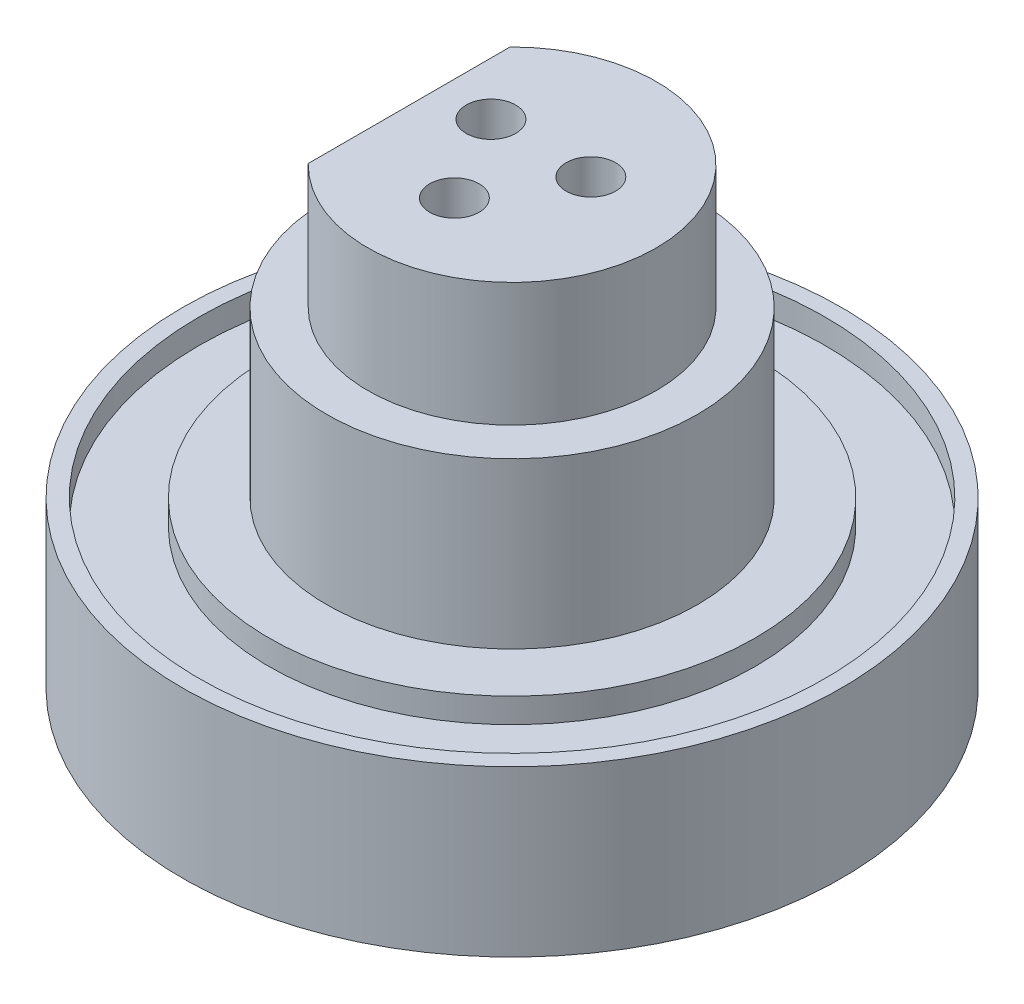
ISO-10303-21;
HEADER;
FILE_DESCRIPTION(('STEP AP214'),'2;1');
FILE_NAME('part.step','',(''),(''),'','','');
FILE_SCHEMA(('AUTOMOTIVE_DESIGN { 1 0 10303 214 1 1 1 1 }'));
ENDSEC;
DATA;
#1=APPLICATION_CONTEXT('core data for automotive mechanical design processes');
#2=APPLICATION_PROTOCOL_DEFINITION('international standard','automotive_design',2000,#1);
#3=PRODUCT_CONTEXT('',#1,'mechanical');
#4=PRODUCT('Part','Part','',(#3));
#5=PRODUCT_RELATED_PRODUCT_CATEGORY('part','',(#4));
#6=PRODUCT_DEFINITION_FORMATION('','',#4);
#7=PRODUCT_DEFINITION_CONTEXT('part definition',#1,'design');
#8=PRODUCT_DEFINITION('design','',#6,#7);
#9=PRODUCT_DEFINITION_SHAPE('','',#8);
#10=(LENGTH_UNIT() NAMED_UNIT(*) SI_UNIT(.MILLI.,.METRE.));
#11=(NAMED_UNIT(*) PLANE_ANGLE_UNIT() SI_UNIT($,.RADIAN.));
#12=(NAMED_UNIT(*) SI_UNIT($,.STERADIAN.) SOLID_ANGLE_UNIT());
#13=UNCERTAINTY_MEASURE_WITH_UNIT(LENGTH_MEASURE(1.E-05),#10,'distance_accuracy_value','');
#14=(GEOMETRIC_REPRESENTATION_CONTEXT(3) GLOBAL_UNCERTAINTY_ASSIGNED_CONTEXT((#13)) GLOBAL_UNIT_ASSIGNED_CONTEXT((#10,
#11,#12)) REPRESENTATION_CONTEXT('',''));
#15=CARTESIAN_POINT('',(0.,0.,0.));
#16=DIRECTION('',(0.,0.,1.));
#17=DIRECTION('',(1.,0.,0.));
#18=AXIS2_PLACEMENT_3D('',#15,#16,#17);
#19=CARTESIAN_POINT('',(0.,0.,0.));
#20=DIRECTION('',(0.,-1.,0.));
#21=DIRECTION('',(0.,0.,-1.));
#22=AXIS2_PLACEMENT_3D('',#19,#20,#21);
#23=PLANE('',#22);
#24=CARTESIAN_POINT('',(0.,0.,0.));
#25=DIRECTION('',(0.,-1.,0.));
#26=DIRECTION('',(1.,0.,0.));
#27=AXIS2_PLACEMENT_3D('',#24,#25,#26);
#28=CIRCLE('',#27,22.5);
#29=CARTESIAN_POINT('',(-22.5,0.,0.));
#30=VERTEX_POINT('',#29);
#31=EDGE_CURVE('E10',#30,#30,#28,.T.);
#32=ORIENTED_EDGE('',*,*,#31,.T.);
#33=EDGE_LOOP('',(#32));
#34=FACE_BOUND('',#33,.T.);
#35=CARTESIAN_POINT('',(0.,0.,0.));
#36=DIRECTION('',(0.,1.,0.));
#37=DIRECTION('',(-1.,0.,0.));
#38=AXIS2_PLACEMENT_3D('',#35,#36,#37);
#39=CIRCLE('',#38,29.5);
#40=CARTESIAN_POINT('',(29.5,0.,0.));
#41=VERTEX_POINT('',#40);
#42=EDGE_CURVE('E358',#41,#41,#39,.T.);
#43=ORIENTED_EDGE('',*,*,#42,.T.);
#44=EDGE_LOOP('',(#43));
#45=FACE_BOUND('',#44,.T.);
#46=ADVANCED_FACE('F15',(#34,#45),#23,.F.);
#47=CARTESIAN_POINT('',(0.,0.,0.));
#48=DIRECTION('',(0.,1.,0.));
#49=DIRECTION('',(1.,0.,0.));
#50=AXIS2_PLACEMENT_3D('',#47,#48,#49);
#51=CYLINDRICAL_SURFACE('',#50,22.5);
#52=CARTESIAN_POINT('',(0.,20.,0.));
#53=DIRECTION('',(0.,-1.,0.));
#54=DIRECTION('',(1.,0.,0.));
#55=AXIS2_PLACEMENT_3D('',#52,#53,#54);
#56=CIRCLE('',#55,22.5);
#57=CARTESIAN_POINT('',(-22.5,20.,0.));
#58=VERTEX_POINT('',#57);
#59=EDGE_CURVE('E184',#58,#58,#56,.T.);
#60=ORIENTED_EDGE('',*,*,#59,.T.);
#61=DIRECTION('',(0.,-1.,0.));
#62=VECTOR('',#61,1.);
#63=CARTESIAN_POINT('',(-22.5,0.,0.));
#64=LINE('',#63,#62);
#65=EDGE_CURVE('E25',#58,#30,#64,.T.);
#66=ORIENTED_EDGE('',*,*,#65,.T.);
#67=ORIENTED_EDGE('',*,*,#31,.F.);
#68=ORIENTED_EDGE('',*,*,#65,.F.);
#69=EDGE_LOOP('',(#60,#66,#67,#68));
#70=FACE_BOUND('',#69,.T.);
#71=ADVANCED_FACE('F453',(#70),#51,.T.);
#72=CARTESIAN_POINT('',(0.,30.,0.));
#73=DIRECTION('',(0.,1.,0.));
#74=DIRECTION('',(1.,0.,0.));
#75=AXIS2_PLACEMENT_3D('',#72,#73,#74);
#76=CYLINDRICAL_SURFACE('',#75,17.5);
#77=CARTESIAN_POINT('',(0.,35.,0.));
#78=DIRECTION('',(0.,-1.,0.));
#79=DIRECTION('',(1.,0.,0.));
#80=AXIS2_PLACEMENT_3D('',#77,#78,#79);
#81=CIRCLE('',#80,17.5);
#82=CARTESIAN_POINT('',(-12.5,35.,-12.2474487139159));
#83=VERTEX_POINT('',#82);
#84=CARTESIAN_POINT('',(-12.5,35.,12.2474487139159));
#85=VERTEX_POINT('',#84);
#86=EDGE_CURVE('E188',#83,#85,#81,.T.);
#87=ORIENTED_EDGE('',*,*,#86,.T.);
#88=DIRECTION('',(0.,-1.,0.));
#89=VECTOR('',#88,1.);
#90=CARTESIAN_POINT('',(-12.5,35.,12.2474487139159));
#91=LINE('',#90,#89);
#92=CARTESIAN_POINT('',(-12.5,20.,12.2474487139159));
#93=VERTEX_POINT('',#92);
#94=EDGE_CURVE('E209',#85,#93,#91,.T.);
#95=ORIENTED_EDGE('',*,*,#94,.T.);
#96=CARTESIAN_POINT('',(0.,20.,0.));
#97=DIRECTION('',(0.,-1.,0.));
#98=DIRECTION('',(-0.571428571428571,0.,0.82065180664829));
#99=AXIS2_PLACEMENT_3D('',#96,#97,#98);
#100=CIRCLE('',#99,17.5);
#101=CARTESIAN_POINT('',(-12.5,20.,-12.2474487139159));
#102=VERTEX_POINT('',#101);
#103=EDGE_CURVE('E18',#102,#93,#100,.T.);
#104=ORIENTED_EDGE('',*,*,#103,.F.);
#105=DIRECTION('',(0.,-1.,0.));
#106=VECTOR('',#105,1.);
#107=CARTESIAN_POINT('',(-12.5,35.,-12.2474487139159));
#108=LINE('',#107,#106);
#109=EDGE_CURVE('E197',#83,#102,#108,.T.);
#110=ORIENTED_EDGE('',*,*,#109,.F.);
#111=EDGE_LOOP('',(#87,#95,#104,#110));
#112=FACE_BOUND('',#111,.T.);
#113=ADVANCED_FACE('F274',(#112),#76,.T.);
#114=CARTESIAN_POINT('',(0.,0.,0.));
#115=DIRECTION('',(0.,-1.,0.));
#116=DIRECTION('',(1.,0.,0.));
#117=AXIS2_PLACEMENT_3D('',#114,#115,#116);
#118=CYLINDRICAL_SURFACE('',#117,40.);
#119=CARTESIAN_POINT('',(0.,-20.,0.));
#120=DIRECTION('',(0.,-1.,0.));
#121=DIRECTION('',(1.,0.,0.));
#122=AXIS2_PLACEMENT_3D('',#119,#120,#121);
#123=CIRCLE('',#122,40.);
#124=CARTESIAN_POINT('',(-40.,-20.,0.));
#125=VERTEX_POINT('',#124);
#126=EDGE_CURVE('E335',#125,#125,#123,.T.);
#127=ORIENTED_EDGE('',*,*,#126,.F.);
#128=DIRECTION('',(0.,1.,0.));
#129=VECTOR('',#128,1.);
#130=CARTESIAN_POINT('',(-40.,0.,0.));
#131=LINE('',#130,#129);
#132=CARTESIAN_POINT('',(-40.,0.,0.));
#133=VERTEX_POINT('',#132);
#134=EDGE_CURVE('E344',#125,#133,#131,.T.);
#135=ORIENTED_EDGE('',*,*,#134,.T.);
#136=CARTESIAN_POINT('',(0.,0.,0.));
#137=DIRECTION('',(0.,1.,0.));
#138=DIRECTION('',(1.,0.,0.));
#139=AXIS2_PLACEMENT_3D('',#136,#137,#138);
#140=CIRCLE('',#139,40.);
#141=EDGE_CURVE('E192',#133,#133,#140,.T.);
#142=ORIENTED_EDGE('',*,*,#141,.F.);
#143=ORIENTED_EDGE('',*,*,#134,.F.);
#144=EDGE_LOOP('',(#127,#135,#142,#143));
#145=FACE_BOUND('',#144,.T.);
#146=ADVANCED_FACE('F438',(#145),#118,.T.);
#147=CARTESIAN_POINT('',(0.,-20.,0.));
#148=DIRECTION('',(0.,1.,0.));
#149=DIRECTION('',(1.,0.,0.));
#150=AXIS2_PLACEMENT_3D('',#147,#148,#149);
#151=PLANE('',#150);
#152=CARTESIAN_POINT('',(0.,-20.,0.));
#153=DIRECTION('',(0.,1.,0.));
#154=DIRECTION('',(1.,0.,0.));
#155=AXIS2_PLACEMENT_3D('',#152,#153,#154);
#156=CIRCLE('',#155,38.);
#157=CARTESIAN_POINT('',(-38.,-20.,0.));
#158=VERTEX_POINT('',#157);
#159=EDGE_CURVE('E257',#158,#158,#156,.T.);
#160=ORIENTED_EDGE('',*,*,#159,.T.);
#161=EDGE_LOOP('',(#160));
#162=FACE_BOUND('',#161,.T.);
#163=ORIENTED_EDGE('',*,*,#126,.T.);
#164=EDGE_LOOP('',(#163));
#165=FACE_BOUND('',#164,.T.);
#166=ADVANCED_FACE('F326',(#162,#165),#151,.F.);
#167=CARTESIAN_POINT('',(0.,-17.,0.));
#168=DIRECTION('',(0.,-1.,0.));
#169=DIRECTION('',(0.,0.,-1.));
#170=AXIS2_PLACEMENT_3D('',#167,#168,#169);
#171=PLANE('',#170);
#172=CARTESIAN_POINT('',(0.,-17.,0.));
#173=DIRECTION('',(0.,-1.,0.));
#174=DIRECTION('',(-1.,0.,0.));
#175=AXIS2_PLACEMENT_3D('',#172,#173,#174);
#176=CIRCLE('',#175,29.5);
#177=CARTESIAN_POINT('',(29.5,-17.,0.));
#178=VERTEX_POINT('',#177);
#179=EDGE_CURVE('E248',#178,#178,#176,.T.);
#180=ORIENTED_EDGE('',*,*,#179,.F.);
#181=EDGE_LOOP('',(#180));
#182=FACE_BOUND('',#181,.T.);
#183=CARTESIAN_POINT('',(0.,-17.,0.));
#184=DIRECTION('',(0.,1.,0.));
#185=DIRECTION('',(1.,0.,0.));
#186=AXIS2_PLACEMENT_3D('',#183,#184,#185);
#187=CIRCLE('',#186,38.);
#188=CARTESIAN_POINT('',(-38.,-17.,0.));
#189=VERTEX_POINT('',#188);
#190=EDGE_CURVE('E322',#189,#189,#187,.T.);
#191=ORIENTED_EDGE('',*,*,#190,.F.);
#192=EDGE_LOOP('',(#191));
#193=FACE_BOUND('',#192,.T.);
#194=ADVANCED_FACE('F440',(#182,#193),#171,.T.);
#195=CARTESIAN_POINT('',(0.,-20.,0.));
#196=DIRECTION('',(0.,1.,0.));
#197=DIRECTION('',(1.,0.,0.));
#198=AXIS2_PLACEMENT_3D('',#195,#196,#197);
#199=CYLINDRICAL_SURFACE('',#198,38.);
#200=ORIENTED_EDGE('',*,*,#159,.F.);
#201=DIRECTION('',(0.,1.,0.));
#202=VECTOR('',#201,1.);
#203=CARTESIAN_POINT('',(-38.,-20.,0.));
#204=LINE('',#203,#202);
#205=EDGE_CURVE('E318',#158,#189,#204,.T.);
#206=ORIENTED_EDGE('',*,*,#205,.T.);
#207=ORIENTED_EDGE('',*,*,#190,.T.);
#208=ORIENTED_EDGE('',*,*,#205,.F.);
#209=EDGE_LOOP('',(#200,#206,#207,#208));
#210=FACE_BOUND('',#209,.T.);
#211=ADVANCED_FACE('F320',(#210),#199,.F.);
#212=CARTESIAN_POINT('',(0.,-20.,0.));
#213=DIRECTION('',(0.,1.,0.));
#214=DIRECTION('',(-1.,0.,0.));
#215=AXIS2_PLACEMENT_3D('',#212,#213,#214);
#216=CYLINDRICAL_SURFACE('',#215,29.5);
#217=CARTESIAN_POINT('',(0.,-20.,0.));
#218=DIRECTION('',(0.,-1.,0.));
#219=DIRECTION('',(-1.,0.,0.));
#220=AXIS2_PLACEMENT_3D('',#217,#218,#219);
#221=CIRCLE('',#220,29.5);
#222=CARTESIAN_POINT('',(29.5,-20.,0.));
#223=VERTEX_POINT('',#222);
#224=EDGE_CURVE('E205',#223,#223,#221,.T.);
#225=ORIENTED_EDGE('',*,*,#224,.F.);
#226=DIRECTION('',(0.,1.,0.));
#227=VECTOR('',#226,1.);
#228=CARTESIAN_POINT('',(29.5,-20.,0.));
#229=LINE('',#228,#227);
#230=EDGE_CURVE('E240',#223,#178,#229,.T.);
#231=ORIENTED_EDGE('',*,*,#230,.T.);
#232=ORIENTED_EDGE('',*,*,#179,.T.);
#233=ORIENTED_EDGE('',*,*,#230,.F.);
#234=EDGE_LOOP('',(#225,#231,#232,#233));
#235=FACE_BOUND('',#234,.T.);
#236=ADVANCED_FACE('F481',(#235),#216,.T.);
#237=CARTESIAN_POINT('',(0.,-20.,0.));
#238=DIRECTION('',(0.,1.,0.));
#239=DIRECTION('',(1.,0.,0.));
#240=AXIS2_PLACEMENT_3D('',#237,#238,#239);
#241=PLANE('',#240);
#242=CARTESIAN_POINT('',(0.,-20.,0.));
#243=DIRECTION('',(0.,1.,0.));
#244=DIRECTION('',(1.,0.,0.));
#245=AXIS2_PLACEMENT_3D('',#242,#243,#244);
#246=CIRCLE('',#245,25.);
#247=CARTESIAN_POINT('',(-25.,-20.,0.));
#248=VERTEX_POINT('',#247);
#249=EDGE_CURVE('E196',#248,#248,#246,.T.);
#250=ORIENTED_EDGE('',*,*,#249,.T.);
#251=EDGE_LOOP('',(#250));
#252=FACE_BOUND('',#251,.T.);
#253=ORIENTED_EDGE('',*,*,#224,.T.);
#254=EDGE_LOOP('',(#253));
#255=FACE_BOUND('',#254,.T.);
#256=ADVANCED_FACE('F433',(#252,#255),#241,.F.);
#257=CARTESIAN_POINT('',(0.,0.,0.));
#258=DIRECTION('',(0.,-1.,0.));
#259=DIRECTION('',(0.,0.,-1.));
#260=AXIS2_PLACEMENT_3D('',#257,#258,#259);
#261=PLANE('',#260);
#262=CARTESIAN_POINT('',(0.,0.,0.));
#263=DIRECTION('',(0.,-1.,0.));
#264=DIRECTION('',(1.,0.,0.));
#265=AXIS2_PLACEMENT_3D('',#262,#263,#264);
#266=CIRCLE('',#265,38.);
#267=CARTESIAN_POINT('',(-38.,0.,0.));
#268=VERTEX_POINT('',#267);
#269=EDGE_CURVE('E219',#268,#268,#266,.T.);
#270=ORIENTED_EDGE('',*,*,#269,.T.);
#271=EDGE_LOOP('',(#270));
#272=FACE_BOUND('',#271,.T.);
#273=ORIENTED_EDGE('',*,*,#141,.T.);
#274=EDGE_LOOP('',(#273));
#275=FACE_BOUND('',#274,.T.);
#276=ADVANCED_FACE('F429',(#272,#275),#261,.F.);
#277=CARTESIAN_POINT('',(0.,-3.,0.));
#278=DIRECTION('',(0.,1.,0.));
#279=DIRECTION('',(1.,0.,0.));
#280=AXIS2_PLACEMENT_3D('',#277,#278,#279);
#281=PLANE('',#280);
#282=CARTESIAN_POINT('',(0.,-3.,0.));
#283=DIRECTION('',(0.,1.,0.));
#284=DIRECTION('',(-1.,0.,0.));
#285=AXIS2_PLACEMENT_3D('',#282,#283,#284);
#286=CIRCLE('',#285,29.5);
#287=CARTESIAN_POINT('',(29.5,-3.,0.));
#288=VERTEX_POINT('',#287);
#289=EDGE_CURVE('E215',#288,#288,#286,.T.);
#290=ORIENTED_EDGE('',*,*,#289,.F.);
#291=EDGE_LOOP('',(#290));
#292=FACE_BOUND('',#291,.T.);
#293=CARTESIAN_POINT('',(0.,-3.,0.));
#294=DIRECTION('',(0.,-1.,0.));
#295=DIRECTION('',(1.,0.,0.));
#296=AXIS2_PLACEMENT_3D('',#293,#294,#295);
#297=CIRCLE('',#296,38.);
#298=CARTESIAN_POINT('',(-38.,-3.,0.));
#299=VERTEX_POINT('',#298);
#300=EDGE_CURVE('E189',#299,#299,#297,.T.);
#301=ORIENTED_EDGE('',*,*,#300,.F.);
#302=EDGE_LOOP('',(#301));
#303=FACE_BOUND('',#302,.T.);
#304=ADVANCED_FACE('F432',(#292,#303),#281,.T.);
#305=CARTESIAN_POINT('',(0.,0.,0.));
#306=DIRECTION('',(0.,-1.,0.));
#307=DIRECTION('',(1.,0.,0.));
#308=AXIS2_PLACEMENT_3D('',#305,#306,#307);
#309=CYLINDRICAL_SURFACE('',#308,38.);
#310=ORIENTED_EDGE('',*,*,#269,.F.);
#311=DIRECTION('',(0.,-1.,0.));
#312=VECTOR('',#311,1.);
#313=CARTESIAN_POINT('',(-38.,0.,0.));
#314=LINE('',#313,#312);
#315=EDGE_CURVE('E139',#268,#299,#314,.T.);
#316=ORIENTED_EDGE('',*,*,#315,.T.);
#317=ORIENTED_EDGE('',*,*,#300,.T.);
#318=ORIENTED_EDGE('',*,*,#315,.F.);
#319=EDGE_LOOP('',(#310,#316,#317,#318));
#320=FACE_BOUND('',#319,.T.);
#321=ADVANCED_FACE('F426',(#320),#309,.F.);
#322=CARTESIAN_POINT('',(0.,0.,0.));
#323=DIRECTION('',(0.,-1.,0.));
#324=DIRECTION('',(-1.,0.,0.));
#325=AXIS2_PLACEMENT_3D('',#322,#323,#324);
#326=CYLINDRICAL_SURFACE('',#325,29.5);
#327=ORIENTED_EDGE('',*,*,#42,.F.);
#328=DIRECTION('',(0.,-1.,0.));
#329=VECTOR('',#328,1.);
#330=CARTESIAN_POINT('',(29.5,0.,0.));
#331=LINE('',#330,#329);
#332=EDGE_CURVE('E166',#41,#288,#331,.T.);
#333=ORIENTED_EDGE('',*,*,#332,.T.);
#334=ORIENTED_EDGE('',*,*,#289,.T.);
#335=ORIENTED_EDGE('',*,*,#332,.F.);
#336=EDGE_LOOP('',(#327,#333,#334,#335));
#337=FACE_BOUND('',#336,.T.);
#338=ADVANCED_FACE('F492',(#337),#326,.T.);
#339=CARTESIAN_POINT('',(0.,20.,0.));
#340=DIRECTION('',(0.,1.,0.));
#341=DIRECTION('',(1.,0.,0.));
#342=AXIS2_PLACEMENT_3D('',#339,#340,#341);
#343=PLANE('',#342);
#344=ORIENTED_EDGE('',*,*,#103,.T.);
#345=DIRECTION('',(0.,0.,-1.));
#346=VECTOR('',#345,1.);
#347=CARTESIAN_POINT('',(-12.5,20.,6.12372435695795));
#348=LINE('',#347,#346);
#349=EDGE_CURVE('E229',#93,#102,#348,.T.);
#350=ORIENTED_EDGE('',*,*,#349,.T.);
#351=EDGE_LOOP('',(#344,#350));
#352=FACE_BOUND('',#351,.T.);
#353=ORIENTED_EDGE('',*,*,#59,.F.);
#354=EDGE_LOOP('',(#353));
#355=FACE_BOUND('',#354,.T.);
#356=ADVANCED_FACE('F266',(#352,#355),#343,.T.);
#357=CARTESIAN_POINT('',(3.75,35.,0.));
#358=DIRECTION('',(0.,1.,0.));
#359=DIRECTION('',(1.,0.,0.));
#360=AXIS2_PLACEMENT_3D('',#357,#358,#359);
#361=PLANE('',#360);
#362=CARTESIAN_POINT('',(-6.06217782649107,35.,-3.5));
#363=DIRECTION('',(0.,-1.,0.));
#364=DIRECTION('',(1.,0.,0.));
#365=AXIS2_PLACEMENT_3D('',#362,#363,#364);
#366=CIRCLE('',#365,3.);
#367=CARTESIAN_POINT('',(-9.06217782649107,35.,-3.5));
#368=VERTEX_POINT('',#367);
#369=EDGE_CURVE('E182',#368,#368,#366,.T.);
#370=ORIENTED_EDGE('',*,*,#369,.T.);
#371=EDGE_LOOP('',(#370));
#372=FACE_BOUND('',#371,.T.);
#373=CARTESIAN_POINT('',(6.06217782649107,35.,-3.5));
#374=DIRECTION('',(0.,-1.,0.));
#375=DIRECTION('',(1.,0.,0.));
#376=AXIS2_PLACEMENT_3D('',#373,#374,#375);
#377=CIRCLE('',#376,3.);
#378=CARTESIAN_POINT('',(3.06217782649107,35.,-3.5));
#379=VERTEX_POINT('',#378);
#380=EDGE_CURVE('E222',#379,#379,#377,.T.);
#381=ORIENTED_EDGE('',*,*,#380,.T.);
#382=EDGE_LOOP('',(#381));
#383=FACE_BOUND('',#382,.T.);
#384=CARTESIAN_POINT('',(0.,35.,7.));
#385=DIRECTION('',(0.,-1.,0.));
#386=DIRECTION('',(1.,0.,0.));
#387=AXIS2_PLACEMENT_3D('',#384,#385,#386);
#388=CIRCLE('',#387,3.);
#389=CARTESIAN_POINT('',(-3.,35.,7.));
#390=VERTEX_POINT('',#389);
#391=EDGE_CURVE('E124',#390,#390,#388,.T.);
#392=ORIENTED_EDGE('',*,*,#391,.T.);
#393=EDGE_LOOP('',(#392));
#394=FACE_BOUND('',#393,.T.);
#395=ORIENTED_EDGE('',*,*,#86,.F.);
#396=DIRECTION('',(0.,0.,1.));
#397=VECTOR('',#396,1.);
#398=CARTESIAN_POINT('',(-12.5,35.,-12.2474487139159));
#399=LINE('',#398,#397);
#400=EDGE_CURVE('E201',#83,#85,#399,.T.);
#401=ORIENTED_EDGE('',*,*,#400,.T.);
#402=EDGE_LOOP('',(#395,#401));
#403=FACE_BOUND('',#402,.T.);
#404=ADVANCED_FACE('F128',(#372,#383,#394,#403),#361,.T.);
#405=CARTESIAN_POINT('',(0.,-20.,0.));
#406=DIRECTION('',(0.,-1.,0.));
#407=DIRECTION('',(1.,0.,0.));
#408=AXIS2_PLACEMENT_3D('',#405,#406,#407);
#409=CYLINDRICAL_SURFACE('',#408,25.);
#410=CARTESIAN_POINT('',(0.,-26.,0.));
#411=DIRECTION('',(0.,1.,0.));
#412=DIRECTION('',(1.,0.,0.));
#413=AXIS2_PLACEMENT_3D('',#410,#411,#412);
#414=CIRCLE('',#413,25.);
#415=CARTESIAN_POINT('',(-25.,-26.,0.));
#416=VERTEX_POINT('',#415);
#417=EDGE_CURVE('E173',#416,#416,#414,.T.);
#418=ORIENTED_EDGE('',*,*,#417,.T.);
#419=DIRECTION('',(0.,1.,0.));
#420=VECTOR('',#419,1.);
#421=CARTESIAN_POINT('',(-25.,-20.,0.));
#422=LINE('',#421,#420);
#423=EDGE_CURVE('E101',#416,#248,#422,.T.);
#424=ORIENTED_EDGE('',*,*,#423,.T.);
#425=ORIENTED_EDGE('',*,*,#249,.F.);
#426=ORIENTED_EDGE('',*,*,#423,.F.);
#427=EDGE_LOOP('',(#418,#424,#425,#426));
#428=FACE_BOUND('',#427,.T.);
#429=ADVANCED_FACE('F484',(#428),#409,.T.);
#430=CARTESIAN_POINT('',(-12.5,35.,12.2474487139159));
#431=DIRECTION('',(-1.,0.,0.));
#432=DIRECTION('',(0.,1.,0.));
#433=AXIS2_PLACEMENT_3D('',#430,#431,#432);
#434=PLANE('',#433);
#435=ORIENTED_EDGE('',*,*,#349,.F.);
#436=ORIENTED_EDGE('',*,*,#94,.F.);
#437=ORIENTED_EDGE('',*,*,#400,.F.);
#438=ORIENTED_EDGE('',*,*,#109,.T.);
#439=EDGE_LOOP('',(#435,#436,#437,#438));
#440=FACE_BOUND('',#439,.T.);
#441=ADVANCED_FACE('F270',(#440),#434,.T.);
#442=CARTESIAN_POINT('',(-6.06217782649107,23.,-3.5));
#443=DIRECTION('',(0.,1.,0.));
#444=DIRECTION('',(1.,0.,0.));
#445=AXIS2_PLACEMENT_3D('',#442,#443,#444);
#446=PLANE('',#445);
#447=CARTESIAN_POINT('',(-6.06217782649107,23.,-3.5));
#448=DIRECTION('',(0.,-1.,0.));
#449=DIRECTION('',(1.,0.,0.));
#450=AXIS2_PLACEMENT_3D('',#447,#448,#449);
#451=CIRCLE('',#450,3.);
#452=CARTESIAN_POINT('',(-9.06217782649107,23.,-3.5));
#453=VERTEX_POINT('',#452);
#454=EDGE_CURVE('E235',#453,#453,#451,.T.);
#455=ORIENTED_EDGE('',*,*,#454,.F.);
#456=EDGE_LOOP('',(#455));
#457=FACE_BOUND('',#456,.T.);
#458=ADVANCED_FACE('F474',(#457),#446,.T.);
#459=CARTESIAN_POINT('',(-6.06217782649107,35.,-3.5));
#460=DIRECTION('',(0.,-1.,0.));
#461=DIRECTION('',(1.,0.,0.));
#462=AXIS2_PLACEMENT_3D('',#459,#460,#461);
#463=CYLINDRICAL_SURFACE('',#462,3.);
#464=ORIENTED_EDGE('',*,*,#369,.F.);
#465=DIRECTION('',(0.,-1.,0.));
#466=VECTOR('',#465,1.);
#467=CARTESIAN_POINT('',(-9.06217782649107,35.,-3.5));
#468=LINE('',#467,#466);
#469=EDGE_CURVE('E237',#368,#453,#468,.T.);
#470=ORIENTED_EDGE('',*,*,#469,.T.);
#471=ORIENTED_EDGE('',*,*,#454,.T.);
#472=ORIENTED_EDGE('',*,*,#469,.F.);
#473=EDGE_LOOP('',(#464,#470,#471,#472));
#474=FACE_BOUND('',#473,.T.);
#475=ADVANCED_FACE('F477',(#474),#463,.F.);
#476=CARTESIAN_POINT('',(6.06217782649107,23.,-3.5));
#477=DIRECTION('',(0.,1.,0.));
#478=DIRECTION('',(1.,0.,0.));
#479=AXIS2_PLACEMENT_3D('',#476,#477,#478);
#480=PLANE('',#479);
#481=CARTESIAN_POINT('',(6.06217782649107,23.,-3.5));
#482=DIRECTION('',(0.,-1.,0.));
#483=DIRECTION('',(1.,0.,0.));
#484=AXIS2_PLACEMENT_3D('',#481,#482,#483);
#485=CIRCLE('',#484,3.);
#486=CARTESIAN_POINT('',(3.06217782649107,23.,-3.5));
#487=VERTEX_POINT('',#486);
#488=EDGE_CURVE('E178',#487,#487,#485,.T.);
#489=ORIENTED_EDGE('',*,*,#488,.F.);
#490=EDGE_LOOP('',(#489));
#491=FACE_BOUND('',#490,.T.);
#492=ADVANCED_FACE('F500',(#491),#480,.T.);
#493=CARTESIAN_POINT('',(6.06217782649107,35.,-3.5));
#494=DIRECTION('',(0.,-1.,0.));
#495=DIRECTION('',(1.,0.,0.));
#496=AXIS2_PLACEMENT_3D('',#493,#494,#495);
#497=CYLINDRICAL_SURFACE('',#496,3.);
#498=ORIENTED_EDGE('',*,*,#380,.F.);
#499=DIRECTION('',(0.,-1.,0.));
#500=VECTOR('',#499,1.);
#501=CARTESIAN_POINT('',(3.06217782649107,35.,-3.5));
#502=LINE('',#501,#500);
#503=EDGE_CURVE('E183',#379,#487,#502,.T.);
#504=ORIENTED_EDGE('',*,*,#503,.T.);
#505=ORIENTED_EDGE('',*,*,#488,.T.);
#506=ORIENTED_EDGE('',*,*,#503,.F.);
#507=EDGE_LOOP('',(#498,#504,#505,#506));
#508=FACE_BOUND('',#507,.T.);
#509=ADVANCED_FACE('F496',(#508),#497,.F.);
#510=CARTESIAN_POINT('',(0.,23.,7.));
#511=DIRECTION('',(0.,1.,0.));
#512=DIRECTION('',(1.,0.,0.));
#513=AXIS2_PLACEMENT_3D('',#510,#511,#512);
#514=PLANE('',#513);
#515=CARTESIAN_POINT('',(0.,23.,7.));
#516=DIRECTION('',(0.,-1.,0.));
#517=DIRECTION('',(1.,0.,0.));
#518=AXIS2_PLACEMENT_3D('',#515,#516,#517);
#519=CIRCLE('',#518,3.);
#520=CARTESIAN_POINT('',(-3.,23.,7.));
#521=VERTEX_POINT('',#520);
#522=EDGE_CURVE('E113',#521,#521,#519,.T.);
#523=ORIENTED_EDGE('',*,*,#522,.F.);
#524=EDGE_LOOP('',(#523));
#525=FACE_BOUND('',#524,.T.);
#526=ADVANCED_FACE('F493',(#525),#514,.T.);
#527=CARTESIAN_POINT('',(0.,35.,7.));
#528=DIRECTION('',(0.,-1.,0.));
#529=DIRECTION('',(1.,0.,0.));
#530=AXIS2_PLACEMENT_3D('',#527,#528,#529);
#531=CYLINDRICAL_SURFACE('',#530,3.);
#532=ORIENTED_EDGE('',*,*,#391,.F.);
#533=DIRECTION('',(0.,-1.,0.));
#534=VECTOR('',#533,1.);
#535=CARTESIAN_POINT('',(-3.,35.,7.));
#536=LINE('',#535,#534);
#537=EDGE_CURVE('E121',#390,#521,#536,.T.);
#538=ORIENTED_EDGE('',*,*,#537,.T.);
#539=ORIENTED_EDGE('',*,*,#522,.T.);
#540=ORIENTED_EDGE('',*,*,#537,.F.);
#541=EDGE_LOOP('',(#532,#538,#539,#540));
#542=FACE_BOUND('',#541,.T.);
#543=ADVANCED_FACE('F123',(#542),#531,.F.);
#544=CARTESIAN_POINT('',(0.0440378449696974,-19.,-1.4210854715202E-13));
#545=DIRECTION('',(0.,-1.,0.));
#546=DIRECTION('',(0.,0.,-1.));
#547=AXIS2_PLACEMENT_3D('',#544,#545,#546);
#548=PLANE('',#547);
#549=CARTESIAN_POINT('',(1.4210854715202E-13,-19.,-1.4210854715202E-13));
#550=DIRECTION('',(0.,1.,0.));
#551=DIRECTION('',(-0.410683314383169,0.,-0.911778051549419));
#552=AXIS2_PLACEMENT_3D('',#549,#550,#551);
#553=CIRCLE('',#552,2.);
#554=CARTESIAN_POINT('',(-1.91192431006074,-19.,0.586979925208709));
#555=VERTEX_POINT('',#554);
#556=CARTESIAN_POINT('',(-0.821366628766198,-19.,-1.82355610309899));
#557=VERTEX_POINT('',#556);
#558=EDGE_CURVE('E87',#555,#557,#553,.T.);
#559=ORIENTED_EDGE('',*,*,#558,.F.);
#560=DIRECTION('',(-0.412192059296657,0.,0.911096979609076));
#561=VECTOR('',#560,1.);
#562=CARTESIAN_POINT('',(-1.91192431006074,-19.,0.586979925208709));
#563=LINE('',#562,#561);
#564=EDGE_CURVE('E172',#557,#555,#563,.T.);
#565=ORIENTED_EDGE('',*,*,#564,.F.);
#566=EDGE_LOOP('',(#559,#565));
#567=FACE_BOUND('',#566,.T.);
#568=ADVANCED_FACE('F486',(#567),#548,.T.);
#569=CARTESIAN_POINT('',(1.4210854715202E-13,-29.,-1.4210854715202E-13));
#570=DIRECTION('',(0.,1.,0.));
#571=DIRECTION('',(0.911096979609074,0.,0.412192059296661));
#572=AXIS2_PLACEMENT_3D('',#569,#570,#571);
#573=CYLINDRICAL_SURFACE('',#572,2.);
#574=DIRECTION('',(0.,1.,0.));
#575=VECTOR('',#574,1.);
#576=CARTESIAN_POINT('',(-1.91192431006074,-29.,0.586979925208709));
#577=LINE('',#576,#575);
#578=CARTESIAN_POINT('',(-1.91192431006074,-31.,0.586979925208709));
#579=VERTEX_POINT('',#578);
#580=EDGE_CURVE('E136',#579,#555,#577,.T.);
#581=ORIENTED_EDGE('',*,*,#580,.T.);
#582=ORIENTED_EDGE('',*,*,#558,.T.);
#583=DIRECTION('',(0.,1.,0.));
#584=VECTOR('',#583,1.);
#585=CARTESIAN_POINT('',(-0.821366628766198,-29.,-1.82355610309899));
#586=LINE('',#585,#584);
#587=CARTESIAN_POINT('',(-0.821366628766198,-31.,-1.82355610309899));
#588=VERTEX_POINT('',#587);
#589=EDGE_CURVE('E168',#588,#557,#586,.T.);
#590=ORIENTED_EDGE('',*,*,#589,.F.);
#591=CARTESIAN_POINT('',(1.4210854715202E-13,-31.,-1.4210854715202E-13));
#592=DIRECTION('',(0.,1.,0.));
#593=DIRECTION('',(0.410683314383169,0.,0.911778051549419));
#594=AXIS2_PLACEMENT_3D('',#591,#592,#593);
#595=CIRCLE('',#594,2.);
#596=EDGE_CURVE('E176',#579,#588,#595,.T.);
#597=ORIENTED_EDGE('',*,*,#596,.F.);
#598=EDGE_LOOP('',(#581,#582,#590,#597));
#599=FACE_BOUND('',#598,.T.);
#600=ADVANCED_FACE('F468',(#599),#573,.F.);
#601=CARTESIAN_POINT('',(-0.821366628766198,-29.,-1.82355610309899));
#602=DIRECTION('',(-0.911096979609076,0.,-0.412192059296657));
#603=DIRECTION('',(-0.412192059296657,0.,0.911096979609076));
#604=AXIS2_PLACEMENT_3D('',#601,#602,#603);
#605=PLANE('',#604);
#606=ORIENTED_EDGE('',*,*,#589,.T.);
#607=ORIENTED_EDGE('',*,*,#564,.T.);
#608=ORIENTED_EDGE('',*,*,#580,.F.);
#609=DIRECTION('',(-0.412192059296657,0.,0.911096979609076));
#610=VECTOR('',#609,1.);
#611=CARTESIAN_POINT('',(-0.821366628766198,-31.,-1.82355610309899));
#612=LINE('',#611,#610);
#613=EDGE_CURVE('E162',#588,#579,#612,.T.);
#614=ORIENTED_EDGE('',*,*,#613,.F.);
#615=EDGE_LOOP('',(#606,#607,#608,#614));
#616=FACE_BOUND('',#615,.T.);
#617=ADVANCED_FACE('F464',(#616),#605,.F.);
#618=CARTESIAN_POINT('',(0.,-26.,0.));
#619=DIRECTION('',(0.,-1.,0.));
#620=DIRECTION('',(0.,0.,-1.));
#621=AXIS2_PLACEMENT_3D('',#618,#619,#620);
#622=PLANE('',#621);
#623=CARTESIAN_POINT('',(0.,-26.,0.));
#624=DIRECTION('',(0.,1.,0.));
#625=DIRECTION('',(1.,0.,0.));
#626=AXIS2_PLACEMENT_3D('',#623,#624,#625);
#627=CIRCLE('',#626,6.);
#628=CARTESIAN_POINT('',(-6.,-26.,0.));
#629=VERTEX_POINT('',#628);
#630=EDGE_CURVE('E152',#629,#629,#627,.T.);
#631=ORIENTED_EDGE('',*,*,#630,.T.);
#632=EDGE_LOOP('',(#631));
#633=FACE_BOUND('',#632,.T.);
#634=ORIENTED_EDGE('',*,*,#417,.F.);
#635=EDGE_LOOP('',(#634));
#636=FACE_BOUND('',#635,.T.);
#637=ADVANCED_FACE('F467',(#633,#636),#622,.T.);
#638=CARTESIAN_POINT('',(0.,-31.,0.));
#639=DIRECTION('',(0.,-1.,0.));
#640=DIRECTION('',(0.,0.,-1.));
#641=AXIS2_PLACEMENT_3D('',#638,#639,#640);
#642=PLANE('',#641);
#643=ORIENTED_EDGE('',*,*,#613,.T.);
#644=ORIENTED_EDGE('',*,*,#596,.T.);
#645=EDGE_LOOP('',(#643,#644));
#646=FACE_BOUND('',#645,.T.);
#647=CARTESIAN_POINT('',(0.,-31.,0.));
#648=DIRECTION('',(0.,-1.,0.));
#649=DIRECTION('',(1.,0.,0.));
#650=AXIS2_PLACEMENT_3D('',#647,#648,#649);
#651=CIRCLE('',#650,6.);
#652=CARTESIAN_POINT('',(-6.,-31.,0.));
#653=VERTEX_POINT('',#652);
#654=EDGE_CURVE('E141',#653,#653,#651,.T.);
#655=ORIENTED_EDGE('',*,*,#654,.T.);
#656=EDGE_LOOP('',(#655));
#657=FACE_BOUND('',#656,.T.);
#658=ADVANCED_FACE('F473',(#646,#657),#642,.T.);
#659=CARTESIAN_POINT('',(0.,-26.,0.));
#660=DIRECTION('',(0.,-1.,0.));
#661=DIRECTION('',(1.,0.,0.));
#662=AXIS2_PLACEMENT_3D('',#659,#660,#661);
#663=CYLINDRICAL_SURFACE('',#662,6.);
#664=ORIENTED_EDGE('',*,*,#654,.F.);
#665=DIRECTION('',(0.,1.,0.));
#666=VECTOR('',#665,1.);
#667=CARTESIAN_POINT('',(-6.,-26.,0.));
#668=LINE('',#667,#666);
#669=EDGE_CURVE('E144',#653,#629,#668,.T.);
#670=ORIENTED_EDGE('',*,*,#669,.T.);
#671=ORIENTED_EDGE('',*,*,#630,.F.);
#672=ORIENTED_EDGE('',*,*,#669,.F.);
#673=EDGE_LOOP('',(#664,#670,#671,#672));
#674=FACE_BOUND('',#673,.T.);
#675=ADVANCED_FACE('F470',(#674),#663,.T.);
#676=CLOSED_SHELL('',(#46,#71,#113,#146,#166,#194,#211,#236,#256,#276,#304,#321,#338,#356,#404,
#429,#441,#458,#475,#492,#509,#526,#543,#568,#600,#617,#637,#658,#675));
#677=MANIFOLD_SOLID_BREP('B1',#676);
#678=ADVANCED_BREP_SHAPE_REPRESENTATION('',(#18,#677),#14);
#679=SHAPE_DEFINITION_REPRESENTATION(#9,#678);
ENDSEC;
END-ISO-10303-21;
